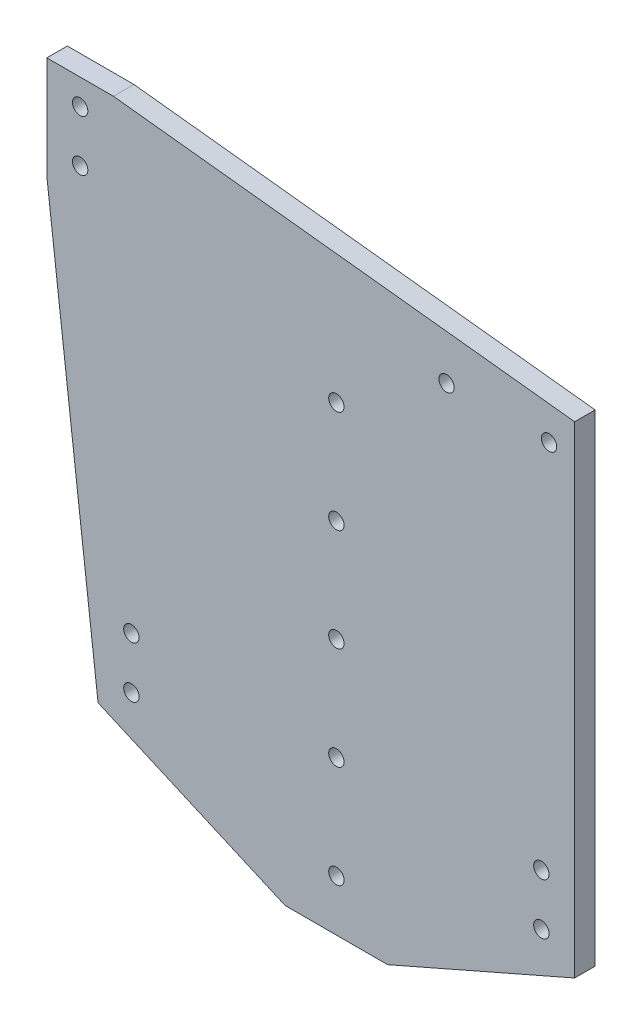
ISO-10303-21;
HEADER;
FILE_DESCRIPTION(('STEP AP214'),'2;1');
FILE_NAME('part.step','',(''),(''),'','','');
FILE_SCHEMA(('AUTOMOTIVE_DESIGN { 1 0 10303 214 1 1 1 1 }'));
ENDSEC;
DATA;
#1=APPLICATION_CONTEXT('core data for automotive mechanical design processes');
#2=APPLICATION_PROTOCOL_DEFINITION('international standard','automotive_design',2000,#1);
#3=PRODUCT_CONTEXT('',#1,'mechanical');
#4=PRODUCT('Part','Part','',(#3));
#5=PRODUCT_RELATED_PRODUCT_CATEGORY('part','',(#4));
#6=PRODUCT_DEFINITION_FORMATION('','',#4);
#7=PRODUCT_DEFINITION_CONTEXT('part definition',#1,'design');
#8=PRODUCT_DEFINITION('design','',#6,#7);
#9=PRODUCT_DEFINITION_SHAPE('','',#8);
#10=(LENGTH_UNIT() NAMED_UNIT(*) SI_UNIT(.MILLI.,.METRE.));
#11=(NAMED_UNIT(*) PLANE_ANGLE_UNIT() SI_UNIT($,.RADIAN.));
#12=(NAMED_UNIT(*) SI_UNIT($,.STERADIAN.) SOLID_ANGLE_UNIT());
#13=UNCERTAINTY_MEASURE_WITH_UNIT(LENGTH_MEASURE(1.E-05),#10,'distance_accuracy_value','');
#14=(GEOMETRIC_REPRESENTATION_CONTEXT(3) GLOBAL_UNCERTAINTY_ASSIGNED_CONTEXT((#13)) GLOBAL_UNIT_ASSIGNED_CONTEXT((#10,
#11,#12)) REPRESENTATION_CONTEXT('',''));
#15=CARTESIAN_POINT('',(0.,0.,0.));
#16=DIRECTION('',(0.,0.,1.));
#17=DIRECTION('',(1.,0.,0.));
#18=AXIS2_PLACEMENT_3D('',#15,#16,#17);
#19=CARTESIAN_POINT('',(0.,0.,4.));
#20=DIRECTION('',(0.,0.,-1.));
#21=DIRECTION('',(-1.,0.,0.));
#22=AXIS2_PLACEMENT_3D('',#19,#20,#21);
#23=PLANE('',#22);
#24=DIRECTION('',(0.915869154004225,0.401476889426509,0.));
#25=VECTOR('',#24,1.);
#26=CARTESIAN_POINT('',(-36.5000000000001,-16.,4.));
#27=LINE('',#26,#25);
#28=CARTESIAN_POINT('',(-36.5000000000001,-16.,4.));
#29=VERTEX_POINT('',#28);
#30=CARTESIAN_POINT('',(0.,0.,4.));
#31=VERTEX_POINT('',#30);
#32=EDGE_CURVE('E153',#29,#31,#27,.T.);
#33=ORIENTED_EDGE('',*,*,#32,.T.);
#34=DIRECTION('',(0.,1.,0.));
#35=VECTOR('',#34,1.);
#36=CARTESIAN_POINT('',(0.,0.,4.));
#37=LINE('',#36,#35);
#38=CARTESIAN_POINT('',(0.,94.,4.));
#39=VERTEX_POINT('',#38);
#40=EDGE_CURVE('E101',#31,#39,#37,.T.);
#41=ORIENTED_EDGE('',*,*,#40,.T.);
#42=DIRECTION('',(-0.993883734673619,0.110431526074846,0.));
#43=VECTOR('',#42,1.);
#44=CARTESIAN_POINT('',(-90.0000000000001,104.,4.));
#45=LINE('',#44,#43);
#46=CARTESIAN_POINT('',(-90.0000000000001,104.,4.));
#47=VERTEX_POINT('',#46);
#48=EDGE_CURVE('E169',#39,#47,#45,.T.);
#49=ORIENTED_EDGE('',*,*,#48,.T.);
#50=DIRECTION('',(-1.,0.,0.));
#51=VECTOR('',#50,1.);
#52=CARTESIAN_POINT('',(-103.,104.,4.));
#53=LINE('',#52,#51);
#54=CARTESIAN_POINT('',(-103.,104.,4.));
#55=VERTEX_POINT('',#54);
#56=EDGE_CURVE('E182',#47,#55,#53,.T.);
#57=ORIENTED_EDGE('',*,*,#56,.T.);
#58=DIRECTION('',(0.,-1.,0.));
#59=VECTOR('',#58,1.);
#60=CARTESIAN_POINT('',(-103.,104.,4.));
#61=LINE('',#60,#59);
#62=CARTESIAN_POINT('',(-103.,84.,4.));
#63=VERTEX_POINT('',#62);
#64=EDGE_CURVE('E119',#55,#63,#61,.T.);
#65=ORIENTED_EDGE('',*,*,#64,.T.);
#66=DIRECTION('',(0.118212889785114,-0.992988274194944,0.));
#67=VECTOR('',#66,1.);
#68=CARTESIAN_POINT('',(-103.,84.,4.));
#69=LINE('',#68,#67);
#70=CARTESIAN_POINT('',(-93.,0.,4.));
#71=VERTEX_POINT('',#70);
#72=EDGE_CURVE('E111',#63,#71,#69,.T.);
#73=ORIENTED_EDGE('',*,*,#72,.T.);
#74=DIRECTION('',(0.915869154004224,-0.40147688942651,0.));
#75=VECTOR('',#74,1.);
#76=CARTESIAN_POINT('',(-93.,0.,4.));
#77=LINE('',#76,#75);
#78=CARTESIAN_POINT('',(-56.5000000000001,-16.,4.));
#79=VERTEX_POINT('',#78);
#80=EDGE_CURVE('E116',#71,#79,#77,.T.);
#81=ORIENTED_EDGE('',*,*,#80,.T.);
#82=DIRECTION('',(1.,0.,0.));
#83=VECTOR('',#82,1.);
#84=CARTESIAN_POINT('',(-56.5000000000001,-16.,4.));
#85=LINE('',#84,#83);
#86=EDGE_CURVE('E59',#79,#29,#85,.T.);
#87=ORIENTED_EDGE('',*,*,#86,.T.);
#88=EDGE_LOOP('',(#33,#41,#49,#57,#65,#73,#81,#87));
#89=FACE_BOUND('',#88,.T.);
#90=CARTESIAN_POINT('',(-86.5000000000001,15.,4.));
#91=DIRECTION('',(0.,0.,1.));
#92=DIRECTION('',(1.,0.,0.));
#93=AXIS2_PLACEMENT_3D('',#90,#91,#92);
#94=CIRCLE('',#93,1.5);
#95=CARTESIAN_POINT('',(-85.0000000000001,15.,4.));
#96=VERTEX_POINT('',#95);
#97=EDGE_CURVE('E142',#96,#96,#94,.T.);
#98=ORIENTED_EDGE('',*,*,#97,.F.);
#99=EDGE_LOOP('',(#98));
#100=FACE_BOUND('',#99,.T.);
#101=CARTESIAN_POINT('',(-86.5000000000001,5.,4.));
#102=DIRECTION('',(0.,0.,1.));
#103=DIRECTION('',(-1.,0.,0.));
#104=AXIS2_PLACEMENT_3D('',#101,#102,#103);
#105=CIRCLE('',#104,1.5);
#106=CARTESIAN_POINT('',(-88.0000000000001,5.,4.));
#107=VERTEX_POINT('',#106);
#108=EDGE_CURVE('E189',#107,#107,#105,.T.);
#109=ORIENTED_EDGE('',*,*,#108,.F.);
#110=EDGE_LOOP('',(#109));
#111=FACE_BOUND('',#110,.T.);
#112=CARTESIAN_POINT('',(-6.50000000000009,5.,4.));
#113=DIRECTION('',(0.,0.,1.));
#114=DIRECTION('',(1.,0.,0.));
#115=AXIS2_PLACEMENT_3D('',#112,#113,#114);
#116=CIRCLE('',#115,1.5);
#117=CARTESIAN_POINT('',(-5.00000000000009,5.,4.));
#118=VERTEX_POINT('',#117);
#119=EDGE_CURVE('E198',#118,#118,#116,.T.);
#120=ORIENTED_EDGE('',*,*,#119,.F.);
#121=EDGE_LOOP('',(#120));
#122=FACE_BOUND('',#121,.T.);
#123=CARTESIAN_POINT('',(-6.50000000000009,15.,4.));
#124=DIRECTION('',(0.,0.,1.));
#125=DIRECTION('',(-1.,0.,0.));
#126=AXIS2_PLACEMENT_3D('',#123,#124,#125);
#127=CIRCLE('',#126,1.5);
#128=CARTESIAN_POINT('',(-8.00000000000009,15.,4.));
#129=VERTEX_POINT('',#128);
#130=EDGE_CURVE('E205',#129,#129,#127,.T.);
#131=ORIENTED_EDGE('',*,*,#130,.F.);
#132=EDGE_LOOP('',(#131));
#133=FACE_BOUND('',#132,.T.);
#134=CARTESIAN_POINT('',(-96.5000000000001,99.,4.));
#135=DIRECTION('',(0.,0.,1.));
#136=DIRECTION('',(1.,0.,0.));
#137=AXIS2_PLACEMENT_3D('',#134,#135,#136);
#138=CIRCLE('',#137,1.5);
#139=CARTESIAN_POINT('',(-95.0000000000001,99.,4.));
#140=VERTEX_POINT('',#139);
#141=EDGE_CURVE('E208',#140,#140,#138,.T.);
#142=ORIENTED_EDGE('',*,*,#141,.F.);
#143=EDGE_LOOP('',(#142));
#144=FACE_BOUND('',#143,.T.);
#145=CARTESIAN_POINT('',(-96.5,89.,4.));
#146=DIRECTION('',(0.,0.,1.));
#147=DIRECTION('',(1.,0.,0.));
#148=AXIS2_PLACEMENT_3D('',#145,#146,#147);
#149=CIRCLE('',#148,1.5);
#150=CARTESIAN_POINT('',(-95.,89.,4.));
#151=VERTEX_POINT('',#150);
#152=EDGE_CURVE('E212',#151,#151,#149,.T.);
#153=ORIENTED_EDGE('',*,*,#152,.F.);
#154=EDGE_LOOP('',(#153));
#155=FACE_BOUND('',#154,.T.);
#156=CARTESIAN_POINT('',(-46.5000000000001,14.,4.));
#157=DIRECTION('',(0.,0.,1.));
#158=DIRECTION('',(1.,0.,0.));
#159=AXIS2_PLACEMENT_3D('',#156,#157,#158);
#160=CIRCLE('',#159,1.5);
#161=CARTESIAN_POINT('',(-45.0000000000001,14.,4.));
#162=VERTEX_POINT('',#161);
#163=EDGE_CURVE('E219',#162,#162,#160,.T.);
#164=ORIENTED_EDGE('',*,*,#163,.F.);
#165=EDGE_LOOP('',(#164));
#166=FACE_BOUND('',#165,.T.);
#167=CARTESIAN_POINT('',(-46.5000000000002,34.,4.));
#168=DIRECTION('',(0.,0.,1.));
#169=DIRECTION('',(1.,0.,0.));
#170=AXIS2_PLACEMENT_3D('',#167,#168,#169);
#171=CIRCLE('',#170,1.5);
#172=CARTESIAN_POINT('',(-45.0000000000002,34.,4.));
#173=VERTEX_POINT('',#172);
#174=EDGE_CURVE('E228',#173,#173,#171,.T.);
#175=ORIENTED_EDGE('',*,*,#174,.F.);
#176=EDGE_LOOP('',(#175));
#177=FACE_BOUND('',#176,.T.);
#178=CARTESIAN_POINT('',(-46.5000000000002,54.,4.));
#179=DIRECTION('',(0.,0.,1.));
#180=DIRECTION('',(1.,0.,0.));
#181=AXIS2_PLACEMENT_3D('',#178,#179,#180);
#182=CIRCLE('',#181,1.5);
#183=CARTESIAN_POINT('',(-45.0000000000002,54.,4.));
#184=VERTEX_POINT('',#183);
#185=EDGE_CURVE('E235',#184,#184,#182,.T.);
#186=ORIENTED_EDGE('',*,*,#185,.F.);
#187=EDGE_LOOP('',(#186));
#188=FACE_BOUND('',#187,.T.);
#189=CARTESIAN_POINT('',(-46.5000000000003,74.,4.));
#190=DIRECTION('',(0.,0.,1.));
#191=DIRECTION('',(1.,0.,0.));
#192=AXIS2_PLACEMENT_3D('',#189,#190,#191);
#193=CIRCLE('',#192,1.5);
#194=CARTESIAN_POINT('',(-45.0000000000003,74.,4.));
#195=VERTEX_POINT('',#194);
#196=EDGE_CURVE('E236',#195,#195,#193,.T.);
#197=ORIENTED_EDGE('',*,*,#196,.F.);
#198=EDGE_LOOP('',(#197));
#199=FACE_BOUND('',#198,.T.);
#200=CARTESIAN_POINT('',(-46.4999999999999,-6.,4.));
#201=DIRECTION('',(0.,0.,1.));
#202=DIRECTION('',(1.,0.,0.));
#203=AXIS2_PLACEMENT_3D('',#200,#201,#202);
#204=CIRCLE('',#203,1.5);
#205=CARTESIAN_POINT('',(-44.9999999999999,-6.,4.));
#206=VERTEX_POINT('',#205);
#207=EDGE_CURVE('E242',#206,#206,#204,.T.);
#208=ORIENTED_EDGE('',*,*,#207,.F.);
#209=EDGE_LOOP('',(#208));
#210=FACE_BOUND('',#209,.T.);
#211=CARTESIAN_POINT('',(-25.,88.,4.));
#212=DIRECTION('',(0.,0.,1.));
#213=DIRECTION('',(1.,0.,0.));
#214=AXIS2_PLACEMENT_3D('',#211,#212,#213);
#215=CIRCLE('',#214,1.5);
#216=CARTESIAN_POINT('',(-23.5,88.,4.));
#217=VERTEX_POINT('',#216);
#218=EDGE_CURVE('E246',#217,#217,#215,.T.);
#219=ORIENTED_EDGE('',*,*,#218,.F.);
#220=EDGE_LOOP('',(#219));
#221=FACE_BOUND('',#220,.T.);
#222=CARTESIAN_POINT('',(-5.,88.,4.));
#223=DIRECTION('',(0.,0.,1.));
#224=DIRECTION('',(1.,0.,0.));
#225=AXIS2_PLACEMENT_3D('',#222,#223,#224);
#226=CIRCLE('',#225,1.5);
#227=CARTESIAN_POINT('',(-3.5,88.,4.));
#228=VERTEX_POINT('',#227);
#229=EDGE_CURVE('E258',#228,#228,#226,.T.);
#230=ORIENTED_EDGE('',*,*,#229,.F.);
#231=EDGE_LOOP('',(#230));
#232=FACE_BOUND('',#231,.T.);
#233=ADVANCED_FACE('F41',(#89,#100,#111,#122,#133,#144,#155,#166,#177,#188,#199,#210,#221,#232),
#23,.F.);
#234=CARTESIAN_POINT('',(0.,0.,0.));
#235=DIRECTION('',(0.,0.,-1.));
#236=DIRECTION('',(-1.,0.,0.));
#237=AXIS2_PLACEMENT_3D('',#234,#235,#236);
#238=PLANE('',#237);
#239=CARTESIAN_POINT('',(-25.,88.,0.));
#240=DIRECTION('',(0.,0.,1.));
#241=DIRECTION('',(1.,0.,0.));
#242=AXIS2_PLACEMENT_3D('',#239,#240,#241);
#243=CIRCLE('',#242,1.5);
#244=CARTESIAN_POINT('',(-23.5,88.,0.));
#245=VERTEX_POINT('',#244);
#246=EDGE_CURVE('E251',#245,#245,#243,.T.);
#247=ORIENTED_EDGE('',*,*,#246,.T.);
#248=EDGE_LOOP('',(#247));
#249=FACE_BOUND('',#248,.T.);
#250=CARTESIAN_POINT('',(-46.5000000000003,74.,0.));
#251=DIRECTION('',(0.,0.,1.));
#252=DIRECTION('',(1.,0.,0.));
#253=AXIS2_PLACEMENT_3D('',#250,#251,#252);
#254=CIRCLE('',#253,1.5);
#255=CARTESIAN_POINT('',(-45.0000000000003,74.,0.));
#256=VERTEX_POINT('',#255);
#257=EDGE_CURVE('E243',#256,#256,#254,.T.);
#258=ORIENTED_EDGE('',*,*,#257,.T.);
#259=EDGE_LOOP('',(#258));
#260=FACE_BOUND('',#259,.T.);
#261=CARTESIAN_POINT('',(-46.5000000000002,34.,0.));
#262=DIRECTION('',(0.,0.,1.));
#263=DIRECTION('',(1.,0.,0.));
#264=AXIS2_PLACEMENT_3D('',#261,#262,#263);
#265=CIRCLE('',#264,1.5);
#266=CARTESIAN_POINT('',(-45.0000000000002,34.,0.));
#267=VERTEX_POINT('',#266);
#268=EDGE_CURVE('E227',#267,#267,#265,.T.);
#269=ORIENTED_EDGE('',*,*,#268,.T.);
#270=EDGE_LOOP('',(#269));
#271=FACE_BOUND('',#270,.T.);
#272=CARTESIAN_POINT('',(-96.5,89.,0.));
#273=DIRECTION('',(0.,0.,1.));
#274=DIRECTION('',(1.,0.,0.));
#275=AXIS2_PLACEMENT_3D('',#272,#273,#274);
#276=CIRCLE('',#275,1.5);
#277=CARTESIAN_POINT('',(-95.,89.,0.));
#278=VERTEX_POINT('',#277);
#279=EDGE_CURVE('E220',#278,#278,#276,.T.);
#280=ORIENTED_EDGE('',*,*,#279,.T.);
#281=EDGE_LOOP('',(#280));
#282=FACE_BOUND('',#281,.T.);
#283=CARTESIAN_POINT('',(-6.50000000000009,15.,0.));
#284=DIRECTION('',(0.,0.,1.));
#285=DIRECTION('',(-1.,0.,0.));
#286=AXIS2_PLACEMENT_3D('',#283,#284,#285);
#287=CIRCLE('',#286,1.5);
#288=CARTESIAN_POINT('',(-8.00000000000009,15.,0.));
#289=VERTEX_POINT('',#288);
#290=EDGE_CURVE('E202',#289,#289,#287,.T.);
#291=ORIENTED_EDGE('',*,*,#290,.T.);
#292=EDGE_LOOP('',(#291));
#293=FACE_BOUND('',#292,.T.);
#294=CARTESIAN_POINT('',(-86.5000000000001,5.,0.));
#295=DIRECTION('',(0.,0.,1.));
#296=DIRECTION('',(-1.,0.,0.));
#297=AXIS2_PLACEMENT_3D('',#294,#295,#296);
#298=CIRCLE('',#297,1.5);
#299=CARTESIAN_POINT('',(-88.0000000000001,5.,0.));
#300=VERTEX_POINT('',#299);
#301=EDGE_CURVE('E193',#300,#300,#298,.T.);
#302=ORIENTED_EDGE('',*,*,#301,.T.);
#303=EDGE_LOOP('',(#302));
#304=FACE_BOUND('',#303,.T.);
#305=DIRECTION('',(0.915869154004225,0.401476889426509,0.));
#306=VECTOR('',#305,1.);
#307=CARTESIAN_POINT('',(-36.5000000000001,-16.,0.));
#308=LINE('',#307,#306);
#309=CARTESIAN_POINT('',(-36.5000000000001,-16.,0.));
#310=VERTEX_POINT('',#309);
#311=CARTESIAN_POINT('',(0.,0.,0.));
#312=VERTEX_POINT('',#311);
#313=EDGE_CURVE('E138',#310,#312,#308,.T.);
#314=ORIENTED_EDGE('',*,*,#313,.F.);
#315=DIRECTION('',(1.,0.,0.));
#316=VECTOR('',#315,1.);
#317=CARTESIAN_POINT('',(-56.5000000000001,-16.,0.));
#318=LINE('',#317,#316);
#319=CARTESIAN_POINT('',(-56.5000000000001,-16.,0.));
#320=VERTEX_POINT('',#319);
#321=EDGE_CURVE('E91',#320,#310,#318,.T.);
#322=ORIENTED_EDGE('',*,*,#321,.F.);
#323=DIRECTION('',(0.915869154004224,-0.40147688942651,0.));
#324=VECTOR('',#323,1.);
#325=CARTESIAN_POINT('',(-93.,0.,0.));
#326=LINE('',#325,#324);
#327=CARTESIAN_POINT('',(-93.,0.,0.));
#328=VERTEX_POINT('',#327);
#329=EDGE_CURVE('E87',#328,#320,#326,.T.);
#330=ORIENTED_EDGE('',*,*,#329,.F.);
#331=DIRECTION('',(0.118212889785114,-0.992988274194944,0.));
#332=VECTOR('',#331,1.);
#333=CARTESIAN_POINT('',(-103.,84.,0.));
#334=LINE('',#333,#332);
#335=CARTESIAN_POINT('',(-103.,84.,0.));
#336=VERTEX_POINT('',#335);
#337=EDGE_CURVE('E126',#336,#328,#334,.T.);
#338=ORIENTED_EDGE('',*,*,#337,.F.);
#339=DIRECTION('',(0.,-1.,0.));
#340=VECTOR('',#339,1.);
#341=CARTESIAN_POINT('',(-103.,104.,0.));
#342=LINE('',#341,#340);
#343=CARTESIAN_POINT('',(-103.,104.,0.));
#344=VERTEX_POINT('',#343);
#345=EDGE_CURVE('E146',#344,#336,#342,.T.);
#346=ORIENTED_EDGE('',*,*,#345,.F.);
#347=DIRECTION('',(-1.,0.,0.));
#348=VECTOR('',#347,1.);
#349=CARTESIAN_POINT('',(-103.,104.,0.));
#350=LINE('',#349,#348);
#351=CARTESIAN_POINT('',(-90.0000000000001,104.,0.));
#352=VERTEX_POINT('',#351);
#353=EDGE_CURVE('E148',#352,#344,#350,.T.);
#354=ORIENTED_EDGE('',*,*,#353,.F.);
#355=DIRECTION('',(-0.993883734673619,0.110431526074846,0.));
#356=VECTOR('',#355,1.);
#357=CARTESIAN_POINT('',(-90.0000000000001,104.,0.));
#358=LINE('',#357,#356);
#359=CARTESIAN_POINT('',(0.,94.,0.));
#360=VERTEX_POINT('',#359);
#361=EDGE_CURVE('E145',#360,#352,#358,.T.);
#362=ORIENTED_EDGE('',*,*,#361,.F.);
#363=DIRECTION('',(0.,1.,0.));
#364=VECTOR('',#363,1.);
#365=CARTESIAN_POINT('',(0.,0.,0.));
#366=LINE('',#365,#364);
#367=EDGE_CURVE('E143',#312,#360,#366,.T.);
#368=ORIENTED_EDGE('',*,*,#367,.F.);
#369=EDGE_LOOP('',(#314,#322,#330,#338,#346,#354,#362,#368));
#370=FACE_BOUND('',#369,.T.);
#371=CARTESIAN_POINT('',(-86.5000000000001,15.,0.));
#372=DIRECTION('',(0.,0.,1.));
#373=DIRECTION('',(1.,0.,0.));
#374=AXIS2_PLACEMENT_3D('',#371,#372,#373);
#375=CIRCLE('',#374,1.5);
#376=CARTESIAN_POINT('',(-85.0000000000001,15.,0.));
#377=VERTEX_POINT('',#376);
#378=EDGE_CURVE('E190',#377,#377,#375,.T.);
#379=ORIENTED_EDGE('',*,*,#378,.T.);
#380=EDGE_LOOP('',(#379));
#381=FACE_BOUND('',#380,.T.);
#382=CARTESIAN_POINT('',(-6.50000000000009,5.,0.));
#383=DIRECTION('',(0.,0.,1.));
#384=DIRECTION('',(1.,0.,0.));
#385=AXIS2_PLACEMENT_3D('',#382,#383,#384);
#386=CIRCLE('',#385,1.5);
#387=CARTESIAN_POINT('',(-5.00000000000009,5.,0.));
#388=VERTEX_POINT('',#387);
#389=EDGE_CURVE('E200',#388,#388,#386,.T.);
#390=ORIENTED_EDGE('',*,*,#389,.T.);
#391=EDGE_LOOP('',(#390));
#392=FACE_BOUND('',#391,.T.);
#393=CARTESIAN_POINT('',(-96.5000000000001,99.,0.));
#394=DIRECTION('',(0.,0.,1.));
#395=DIRECTION('',(1.,0.,0.));
#396=AXIS2_PLACEMENT_3D('',#393,#394,#395);
#397=CIRCLE('',#396,1.5);
#398=CARTESIAN_POINT('',(-95.0000000000001,99.,0.));
#399=VERTEX_POINT('',#398);
#400=EDGE_CURVE('E211',#399,#399,#397,.T.);
#401=ORIENTED_EDGE('',*,*,#400,.T.);
#402=EDGE_LOOP('',(#401));
#403=FACE_BOUND('',#402,.T.);
#404=CARTESIAN_POINT('',(-46.5000000000001,14.,0.));
#405=DIRECTION('',(0.,0.,1.));
#406=DIRECTION('',(1.,0.,0.));
#407=AXIS2_PLACEMENT_3D('',#404,#405,#406);
#408=CIRCLE('',#407,1.5);
#409=CARTESIAN_POINT('',(-45.0000000000001,14.,0.));
#410=VERTEX_POINT('',#409);
#411=EDGE_CURVE('E224',#410,#410,#408,.T.);
#412=ORIENTED_EDGE('',*,*,#411,.T.);
#413=EDGE_LOOP('',(#412));
#414=FACE_BOUND('',#413,.T.);
#415=CARTESIAN_POINT('',(-46.5000000000002,54.,0.));
#416=DIRECTION('',(0.,0.,1.));
#417=DIRECTION('',(1.,0.,0.));
#418=AXIS2_PLACEMENT_3D('',#415,#416,#417);
#419=CIRCLE('',#418,1.5);
#420=CARTESIAN_POINT('',(-45.0000000000002,54.,0.));
#421=VERTEX_POINT('',#420);
#422=EDGE_CURVE('E231',#421,#421,#419,.T.);
#423=ORIENTED_EDGE('',*,*,#422,.T.);
#424=EDGE_LOOP('',(#423));
#425=FACE_BOUND('',#424,.T.);
#426=CARTESIAN_POINT('',(-46.4999999999999,-6.,0.));
#427=DIRECTION('',(0.,0.,1.));
#428=DIRECTION('',(1.,0.,0.));
#429=AXIS2_PLACEMENT_3D('',#426,#427,#428);
#430=CIRCLE('',#429,1.5);
#431=CARTESIAN_POINT('',(-44.9999999999999,-6.,0.));
#432=VERTEX_POINT('',#431);
#433=EDGE_CURVE('E250',#432,#432,#430,.T.);
#434=ORIENTED_EDGE('',*,*,#433,.T.);
#435=EDGE_LOOP('',(#434));
#436=FACE_BOUND('',#435,.T.);
#437=CARTESIAN_POINT('',(-5.,88.,0.));
#438=DIRECTION('',(0.,0.,1.));
#439=DIRECTION('',(1.,0.,0.));
#440=AXIS2_PLACEMENT_3D('',#437,#438,#439);
#441=CIRCLE('',#440,1.5);
#442=CARTESIAN_POINT('',(-3.5,88.,0.));
#443=VERTEX_POINT('',#442);
#444=EDGE_CURVE('E259',#443,#443,#441,.T.);
#445=ORIENTED_EDGE('',*,*,#444,.T.);
#446=EDGE_LOOP('',(#445));
#447=FACE_BOUND('',#446,.T.);
#448=ADVANCED_FACE('F175',(#249,#260,#271,#282,#293,#304,#370,#381,#392,#403,#414,#425,#436,
#447),#238,.T.);
#449=CARTESIAN_POINT('',(-36.5000000000001,-16.,4.));
#450=DIRECTION('',(-0.401476889426509,0.915869154004225,0.));
#451=DIRECTION('',(-0.915869154004225,-0.401476889426509,0.));
#452=AXIS2_PLACEMENT_3D('',#449,#450,#451);
#453=PLANE('',#452);
#454=ORIENTED_EDGE('',*,*,#313,.T.);
#455=DIRECTION('',(0.,0.,-1.));
#456=VECTOR('',#455,1.);
#457=CARTESIAN_POINT('',(0.,0.,4.));
#458=LINE('',#457,#456);
#459=EDGE_CURVE('E11',#31,#312,#458,.T.);
#460=ORIENTED_EDGE('',*,*,#459,.F.);
#461=ORIENTED_EDGE('',*,*,#32,.F.);
#462=DIRECTION('',(0.,0.,-1.));
#463=VECTOR('',#462,1.);
#464=CARTESIAN_POINT('',(-36.5000000000001,-16.,4.));
#465=LINE('',#464,#463);
#466=EDGE_CURVE('E132',#29,#310,#465,.T.);
#467=ORIENTED_EDGE('',*,*,#466,.T.);
#468=EDGE_LOOP('',(#454,#460,#461,#467));
#469=FACE_BOUND('',#468,.T.);
#470=ADVANCED_FACE('F43',(#469),#453,.F.);
#471=CARTESIAN_POINT('',(0.,0.,4.));
#472=DIRECTION('',(-1.,0.,0.));
#473=DIRECTION('',(0.,0.,1.));
#474=AXIS2_PLACEMENT_3D('',#471,#472,#473);
#475=PLANE('',#474);
#476=ORIENTED_EDGE('',*,*,#367,.T.);
#477=DIRECTION('',(0.,0.,-1.));
#478=VECTOR('',#477,1.);
#479=CARTESIAN_POINT('',(0.,94.,4.));
#480=LINE('',#479,#478);
#481=EDGE_CURVE('E49',#39,#360,#480,.T.);
#482=ORIENTED_EDGE('',*,*,#481,.F.);
#483=ORIENTED_EDGE('',*,*,#40,.F.);
#484=ORIENTED_EDGE('',*,*,#459,.T.);
#485=EDGE_LOOP('',(#476,#482,#483,#484));
#486=FACE_BOUND('',#485,.T.);
#487=ADVANCED_FACE('F292',(#486),#475,.F.);
#488=CARTESIAN_POINT('',(-90.0000000000001,104.,4.));
#489=DIRECTION('',(-0.110431526074846,-0.993883734673619,0.));
#490=DIRECTION('',(0.993883734673619,-0.110431526074846,0.));
#491=AXIS2_PLACEMENT_3D('',#488,#489,#490);
#492=PLANE('',#491);
#493=ORIENTED_EDGE('',*,*,#361,.T.);
#494=DIRECTION('',(0.,0.,-1.));
#495=VECTOR('',#494,1.);
#496=CARTESIAN_POINT('',(-90.0000000000001,104.,4.));
#497=LINE('',#496,#495);
#498=EDGE_CURVE('E159',#47,#352,#497,.T.);
#499=ORIENTED_EDGE('',*,*,#498,.F.);
#500=ORIENTED_EDGE('',*,*,#48,.F.);
#501=ORIENTED_EDGE('',*,*,#481,.T.);
#502=EDGE_LOOP('',(#493,#499,#500,#501));
#503=FACE_BOUND('',#502,.T.);
#504=ADVANCED_FACE('F167',(#503),#492,.F.);
#505=CARTESIAN_POINT('',(-103.,104.,4.));
#506=DIRECTION('',(0.,-1.,0.));
#507=DIRECTION('',(0.,0.,-1.));
#508=AXIS2_PLACEMENT_3D('',#505,#506,#507);
#509=PLANE('',#508);
#510=ORIENTED_EDGE('',*,*,#353,.T.);
#511=DIRECTION('',(0.,0.,-1.));
#512=VECTOR('',#511,1.);
#513=CARTESIAN_POINT('',(-103.,104.,4.));
#514=LINE('',#513,#512);
#515=EDGE_CURVE('E160',#55,#344,#514,.T.);
#516=ORIENTED_EDGE('',*,*,#515,.F.);
#517=ORIENTED_EDGE('',*,*,#56,.F.);
#518=ORIENTED_EDGE('',*,*,#498,.T.);
#519=EDGE_LOOP('',(#510,#516,#517,#518));
#520=FACE_BOUND('',#519,.T.);
#521=ADVANCED_FACE('F180',(#520),#509,.F.);
#522=CARTESIAN_POINT('',(-103.,104.,4.));
#523=DIRECTION('',(1.,0.,0.));
#524=DIRECTION('',(0.,0.,-1.));
#525=AXIS2_PLACEMENT_3D('',#522,#523,#524);
#526=PLANE('',#525);
#527=ORIENTED_EDGE('',*,*,#345,.T.);
#528=DIRECTION('',(0.,0.,-1.));
#529=VECTOR('',#528,1.);
#530=CARTESIAN_POINT('',(-103.,84.,4.));
#531=LINE('',#530,#529);
#532=EDGE_CURVE('E129',#63,#336,#531,.T.);
#533=ORIENTED_EDGE('',*,*,#532,.F.);
#534=ORIENTED_EDGE('',*,*,#64,.F.);
#535=ORIENTED_EDGE('',*,*,#515,.T.);
#536=EDGE_LOOP('',(#527,#533,#534,#535));
#537=FACE_BOUND('',#536,.T.);
#538=ADVANCED_FACE('F176',(#537),#526,.F.);
#539=CARTESIAN_POINT('',(-103.,84.,4.));
#540=DIRECTION('',(0.992988274194944,0.118212889785114,0.));
#541=DIRECTION('',(-0.118212889785114,0.992988274194944,0.));
#542=AXIS2_PLACEMENT_3D('',#539,#540,#541);
#543=PLANE('',#542);
#544=ORIENTED_EDGE('',*,*,#337,.T.);
#545=DIRECTION('',(0.,0.,-1.));
#546=VECTOR('',#545,1.);
#547=CARTESIAN_POINT('',(-93.,0.,4.));
#548=LINE('',#547,#546);
#549=EDGE_CURVE('E121',#71,#328,#548,.T.);
#550=ORIENTED_EDGE('',*,*,#549,.F.);
#551=ORIENTED_EDGE('',*,*,#72,.F.);
#552=ORIENTED_EDGE('',*,*,#532,.T.);
#553=EDGE_LOOP('',(#544,#550,#551,#552));
#554=FACE_BOUND('',#553,.T.);
#555=ADVANCED_FACE('F127',(#554),#543,.F.);
#556=CARTESIAN_POINT('',(-93.,0.,4.));
#557=DIRECTION('',(0.401476889426511,0.915869154004224,0.));
#558=DIRECTION('',(-0.915869154004224,0.401476889426511,0.));
#559=AXIS2_PLACEMENT_3D('',#556,#557,#558);
#560=PLANE('',#559);
#561=ORIENTED_EDGE('',*,*,#329,.T.);
#562=DIRECTION('',(0.,0.,-1.));
#563=VECTOR('',#562,1.);
#564=CARTESIAN_POINT('',(-56.5000000000001,-16.,4.));
#565=LINE('',#564,#563);
#566=EDGE_CURVE('E128',#79,#320,#565,.T.);
#567=ORIENTED_EDGE('',*,*,#566,.F.);
#568=ORIENTED_EDGE('',*,*,#80,.F.);
#569=ORIENTED_EDGE('',*,*,#549,.T.);
#570=EDGE_LOOP('',(#561,#567,#568,#569));
#571=FACE_BOUND('',#570,.T.);
#572=ADVANCED_FACE('F135',(#571),#560,.F.);
#573=CARTESIAN_POINT('',(-56.5000000000001,-16.,4.));
#574=DIRECTION('',(0.,1.,0.));
#575=DIRECTION('',(-1.,0.,0.));
#576=AXIS2_PLACEMENT_3D('',#573,#574,#575);
#577=PLANE('',#576);
#578=ORIENTED_EDGE('',*,*,#321,.T.);
#579=ORIENTED_EDGE('',*,*,#466,.F.);
#580=ORIENTED_EDGE('',*,*,#86,.F.);
#581=ORIENTED_EDGE('',*,*,#566,.T.);
#582=EDGE_LOOP('',(#578,#579,#580,#581));
#583=FACE_BOUND('',#582,.T.);
#584=ADVANCED_FACE('F276',(#583),#577,.F.);
#585=CARTESIAN_POINT('',(-86.5000000000001,15.,4.));
#586=DIRECTION('',(0.,0.,-1.));
#587=DIRECTION('',(-1.,0.,0.));
#588=AXIS2_PLACEMENT_3D('',#585,#586,#587);
#589=CYLINDRICAL_SURFACE('',#588,1.5);
#590=ORIENTED_EDGE('',*,*,#97,.T.);
#591=EDGE_LOOP('',(#590));
#592=FACE_BOUND('',#591,.T.);
#593=ORIENTED_EDGE('',*,*,#378,.F.);
#594=EDGE_LOOP('',(#593));
#595=FACE_BOUND('',#594,.T.);
#596=ADVANCED_FACE('F277',(#592,#595),#589,.F.);
#597=CARTESIAN_POINT('',(-86.5000000000001,5.,4.));
#598=DIRECTION('',(0.,0.,-1.));
#599=DIRECTION('',(-1.,0.,0.));
#600=AXIS2_PLACEMENT_3D('',#597,#598,#599);
#601=CYLINDRICAL_SURFACE('',#600,1.5);
#602=ORIENTED_EDGE('',*,*,#108,.T.);
#603=EDGE_LOOP('',(#602));
#604=FACE_BOUND('',#603,.T.);
#605=ORIENTED_EDGE('',*,*,#301,.F.);
#606=EDGE_LOOP('',(#605));
#607=FACE_BOUND('',#606,.T.);
#608=ADVANCED_FACE('F352',(#604,#607),#601,.F.);
#609=CARTESIAN_POINT('',(-6.50000000000009,5.,4.));
#610=DIRECTION('',(0.,0.,-1.));
#611=DIRECTION('',(-1.,0.,0.));
#612=AXIS2_PLACEMENT_3D('',#609,#610,#611);
#613=CYLINDRICAL_SURFACE('',#612,1.5);
#614=ORIENTED_EDGE('',*,*,#119,.T.);
#615=EDGE_LOOP('',(#614));
#616=FACE_BOUND('',#615,.T.);
#617=ORIENTED_EDGE('',*,*,#389,.F.);
#618=EDGE_LOOP('',(#617));
#619=FACE_BOUND('',#618,.T.);
#620=ADVANCED_FACE('F362',(#616,#619),#613,.F.);
#621=CARTESIAN_POINT('',(-6.50000000000009,15.,4.));
#622=DIRECTION('',(0.,0.,-1.));
#623=DIRECTION('',(-1.,0.,0.));
#624=AXIS2_PLACEMENT_3D('',#621,#622,#623);
#625=CYLINDRICAL_SURFACE('',#624,1.5);
#626=ORIENTED_EDGE('',*,*,#130,.T.);
#627=EDGE_LOOP('',(#626));
#628=FACE_BOUND('',#627,.T.);
#629=ORIENTED_EDGE('',*,*,#290,.F.);
#630=EDGE_LOOP('',(#629));
#631=FACE_BOUND('',#630,.T.);
#632=ADVANCED_FACE('F367',(#628,#631),#625,.F.);
#633=CARTESIAN_POINT('',(-96.5000000000001,99.,4.));
#634=DIRECTION('',(0.,0.,-1.));
#635=DIRECTION('',(-1.,0.,0.));
#636=AXIS2_PLACEMENT_3D('',#633,#634,#635);
#637=CYLINDRICAL_SURFACE('',#636,1.5);
#638=ORIENTED_EDGE('',*,*,#141,.T.);
#639=EDGE_LOOP('',(#638));
#640=FACE_BOUND('',#639,.T.);
#641=ORIENTED_EDGE('',*,*,#400,.F.);
#642=EDGE_LOOP('',(#641));
#643=FACE_BOUND('',#642,.T.);
#644=ADVANCED_FACE('F377',(#640,#643),#637,.F.);
#645=CARTESIAN_POINT('',(-96.5,89.,4.));
#646=DIRECTION('',(0.,0.,-1.));
#647=DIRECTION('',(-1.,0.,0.));
#648=AXIS2_PLACEMENT_3D('',#645,#646,#647);
#649=CYLINDRICAL_SURFACE('',#648,1.5);
#650=ORIENTED_EDGE('',*,*,#152,.T.);
#651=EDGE_LOOP('',(#650));
#652=FACE_BOUND('',#651,.T.);
#653=ORIENTED_EDGE('',*,*,#279,.F.);
#654=EDGE_LOOP('',(#653));
#655=FACE_BOUND('',#654,.T.);
#656=ADVANCED_FACE('F389',(#652,#655),#649,.F.);
#657=CARTESIAN_POINT('',(-46.5000000000001,14.,4.));
#658=DIRECTION('',(0.,0.,-1.));
#659=DIRECTION('',(-1.,0.,0.));
#660=AXIS2_PLACEMENT_3D('',#657,#658,#659);
#661=CYLINDRICAL_SURFACE('',#660,1.5);
#662=ORIENTED_EDGE('',*,*,#163,.T.);
#663=EDGE_LOOP('',(#662));
#664=FACE_BOUND('',#663,.T.);
#665=ORIENTED_EDGE('',*,*,#411,.F.);
#666=EDGE_LOOP('',(#665));
#667=FACE_BOUND('',#666,.T.);
#668=ADVANCED_FACE('F400',(#664,#667),#661,.F.);
#669=CARTESIAN_POINT('',(-46.5000000000002,34.,4.));
#670=DIRECTION('',(0.,0.,-1.));
#671=DIRECTION('',(-1.,0.,0.));
#672=AXIS2_PLACEMENT_3D('',#669,#670,#671);
#673=CYLINDRICAL_SURFACE('',#672,1.5);
#674=ORIENTED_EDGE('',*,*,#174,.T.);
#675=EDGE_LOOP('',(#674));
#676=FACE_BOUND('',#675,.T.);
#677=ORIENTED_EDGE('',*,*,#268,.F.);
#678=EDGE_LOOP('',(#677));
#679=FACE_BOUND('',#678,.T.);
#680=ADVANCED_FACE('F408',(#676,#679),#673,.F.);
#681=CARTESIAN_POINT('',(-46.5000000000002,54.,4.));
#682=DIRECTION('',(0.,0.,-1.));
#683=DIRECTION('',(-1.,0.,0.));
#684=AXIS2_PLACEMENT_3D('',#681,#682,#683);
#685=CYLINDRICAL_SURFACE('',#684,1.5);
#686=ORIENTED_EDGE('',*,*,#185,.T.);
#687=EDGE_LOOP('',(#686));
#688=FACE_BOUND('',#687,.T.);
#689=ORIENTED_EDGE('',*,*,#422,.F.);
#690=EDGE_LOOP('',(#689));
#691=FACE_BOUND('',#690,.T.);
#692=ADVANCED_FACE('F411',(#688,#691),#685,.F.);
#693=CARTESIAN_POINT('',(-46.5000000000003,74.,4.));
#694=DIRECTION('',(0.,0.,-1.));
#695=DIRECTION('',(-1.,0.,0.));
#696=AXIS2_PLACEMENT_3D('',#693,#694,#695);
#697=CYLINDRICAL_SURFACE('',#696,1.5);
#698=ORIENTED_EDGE('',*,*,#196,.T.);
#699=EDGE_LOOP('',(#698));
#700=FACE_BOUND('',#699,.T.);
#701=ORIENTED_EDGE('',*,*,#257,.F.);
#702=EDGE_LOOP('',(#701));
#703=FACE_BOUND('',#702,.T.);
#704=ADVANCED_FACE('F424',(#700,#703),#697,.F.);
#705=CARTESIAN_POINT('',(-46.4999999999999,-6.,4.));
#706=DIRECTION('',(0.,0.,-1.));
#707=DIRECTION('',(-1.,0.,0.));
#708=AXIS2_PLACEMENT_3D('',#705,#706,#707);
#709=CYLINDRICAL_SURFACE('',#708,1.5);
#710=ORIENTED_EDGE('',*,*,#207,.T.);
#711=EDGE_LOOP('',(#710));
#712=FACE_BOUND('',#711,.T.);
#713=ORIENTED_EDGE('',*,*,#433,.F.);
#714=EDGE_LOOP('',(#713));
#715=FACE_BOUND('',#714,.T.);
#716=ADVANCED_FACE('F433',(#712,#715),#709,.F.);
#717=CARTESIAN_POINT('',(-25.,88.,4.));
#718=DIRECTION('',(0.,0.,-1.));
#719=DIRECTION('',(-1.,0.,0.));
#720=AXIS2_PLACEMENT_3D('',#717,#718,#719);
#721=CYLINDRICAL_SURFACE('',#720,1.5);
#722=ORIENTED_EDGE('',*,*,#218,.T.);
#723=EDGE_LOOP('',(#722));
#724=FACE_BOUND('',#723,.T.);
#725=ORIENTED_EDGE('',*,*,#246,.F.);
#726=EDGE_LOOP('',(#725));
#727=FACE_BOUND('',#726,.T.);
#728=ADVANCED_FACE('F445',(#724,#727),#721,.F.);
#729=CARTESIAN_POINT('',(-5.,88.,4.));
#730=DIRECTION('',(0.,0.,-1.));
#731=DIRECTION('',(-1.,0.,0.));
#732=AXIS2_PLACEMENT_3D('',#729,#730,#731);
#733=CYLINDRICAL_SURFACE('',#732,1.5);
#734=ORIENTED_EDGE('',*,*,#229,.T.);
#735=EDGE_LOOP('',(#734));
#736=FACE_BOUND('',#735,.T.);
#737=ORIENTED_EDGE('',*,*,#444,.F.);
#738=EDGE_LOOP('',(#737));
#739=FACE_BOUND('',#738,.T.);
#740=ADVANCED_FACE('F264',(#736,#739),#733,.F.);
#741=CLOSED_SHELL('',(#233,#448,#470,#487,#504,#521,#538,#555,#572,#584,#596,#608,#620,#632,
#644,#656,#668,#680,#692,#704,#716,#728,#740));
#742=MANIFOLD_SOLID_BREP('B2',#741);
#743=ADVANCED_BREP_SHAPE_REPRESENTATION('',(#18,#742),#14);
#744=SHAPE_DEFINITION_REPRESENTATION(#9,#743);
ENDSEC;
END-ISO-10303-21;
